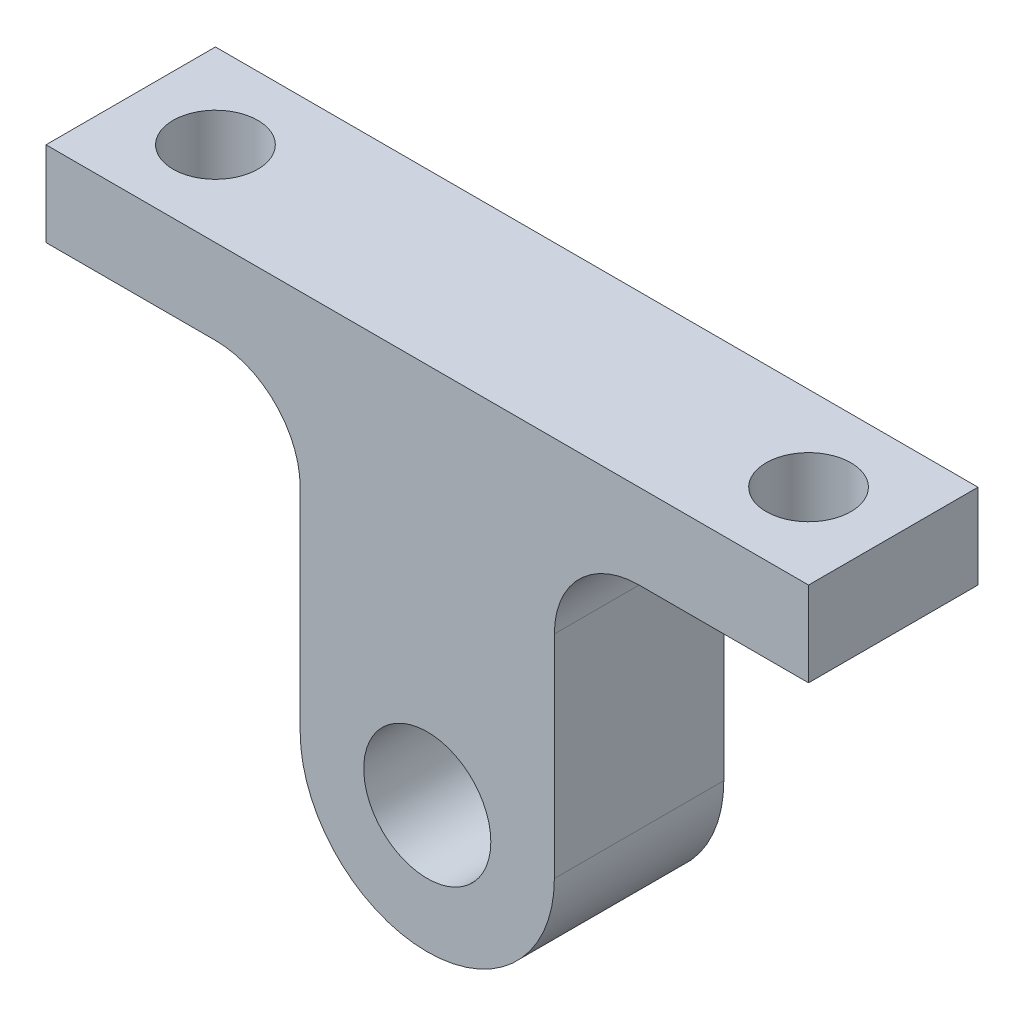
ISO-10303-21;
HEADER;
FILE_DESCRIPTION(('STEP AP214'),'2;1');
FILE_NAME('part.step','',(''),(''),'','','');
FILE_SCHEMA(('AUTOMOTIVE_DESIGN { 1 0 10303 214 1 1 1 1 }'));
ENDSEC;
DATA;
#1=APPLICATION_CONTEXT('core data for automotive mechanical design processes');
#2=APPLICATION_PROTOCOL_DEFINITION('international standard','automotive_design',2000,#1);
#3=PRODUCT_CONTEXT('',#1,'mechanical');
#4=PRODUCT('Part','Part','',(#3));
#5=PRODUCT_RELATED_PRODUCT_CATEGORY('part','',(#4));
#6=PRODUCT_DEFINITION_FORMATION('','',#4);
#7=PRODUCT_DEFINITION_CONTEXT('part definition',#1,'design');
#8=PRODUCT_DEFINITION('design','',#6,#7);
#9=PRODUCT_DEFINITION_SHAPE('','',#8);
#10=(LENGTH_UNIT() NAMED_UNIT(*) SI_UNIT(.MILLI.,.METRE.));
#11=(NAMED_UNIT(*) PLANE_ANGLE_UNIT() SI_UNIT($,.RADIAN.));
#12=(NAMED_UNIT(*) SI_UNIT($,.STERADIAN.) SOLID_ANGLE_UNIT());
#13=UNCERTAINTY_MEASURE_WITH_UNIT(LENGTH_MEASURE(1.E-05),#10,'distance_accuracy_value','');
#14=(GEOMETRIC_REPRESENTATION_CONTEXT(3) GLOBAL_UNCERTAINTY_ASSIGNED_CONTEXT((#13)) GLOBAL_UNIT_ASSIGNED_CONTEXT((#10,
#11,#12)) REPRESENTATION_CONTEXT('',''));
#15=CARTESIAN_POINT('',(0.,0.,0.));
#16=DIRECTION('',(0.,0.,1.));
#17=DIRECTION('',(1.,0.,0.));
#18=AXIS2_PLACEMENT_3D('',#15,#16,#17);
#19=CARTESIAN_POINT('',(0.,0.,6.35));
#20=DIRECTION('',(0.,0.,-1.));
#21=DIRECTION('',(-1.,0.,0.));
#22=AXIS2_PLACEMENT_3D('',#19,#20,#21);
#23=PLANE('',#22);
#24=CARTESIAN_POINT('',(0.,0.,6.35));
#25=DIRECTION('',(0.,0.,-1.));
#26=DIRECTION('',(-1.,0.,0.));
#27=AXIS2_PLACEMENT_3D('',#24,#25,#26);
#28=CIRCLE('',#27,9.525);
#29=CARTESIAN_POINT('',(-9.525,0.,6.35));
#30=VERTEX_POINT('',#29);
#31=CARTESIAN_POINT('',(0.,-9.52500000000001,6.35));
#32=VERTEX_POINT('',#31);
#33=EDGE_CURVE('E52',#30,#32,#28,.F.);
#34=ORIENTED_EDGE('',*,*,#33,.T.);
#35=CARTESIAN_POINT('',(0.,0.,6.35));
#36=DIRECTION('',(0.,0.,-1.));
#37=DIRECTION('',(-1.,0.,0.));
#38=AXIS2_PLACEMENT_3D('',#35,#36,#37);
#39=CIRCLE('',#38,9.525);
#40=CARTESIAN_POINT('',(9.525,0.,6.35));
#41=VERTEX_POINT('',#40);
#42=EDGE_CURVE('E45',#32,#41,#39,.F.);
#43=ORIENTED_EDGE('',*,*,#42,.T.);
#44=DIRECTION('',(0.,1.,0.));
#45=VECTOR('',#44,1.);
#46=CARTESIAN_POINT('',(9.525,-9.52500000000001,6.35));
#47=LINE('',#46,#45);
#48=CARTESIAN_POINT('',(9.525,15.875,6.35));
#49=VERTEX_POINT('',#48);
#50=EDGE_CURVE('E129',#41,#49,#47,.T.);
#51=ORIENTED_EDGE('',*,*,#50,.T.);
#52=CARTESIAN_POINT('',(15.875,15.875,6.35));
#53=DIRECTION('',(0.,0.,-1.));
#54=DIRECTION('',(-1.,0.,0.));
#55=AXIS2_PLACEMENT_3D('',#52,#53,#54);
#56=CIRCLE('',#55,6.35);
#57=CARTESIAN_POINT('',(15.875,22.225,6.35));
#58=VERTEX_POINT('',#57);
#59=EDGE_CURVE('E125',#49,#58,#56,.T.);
#60=ORIENTED_EDGE('',*,*,#59,.T.);
#61=DIRECTION('',(1.,0.,0.));
#62=VECTOR('',#61,1.);
#63=CARTESIAN_POINT('',(9.525,22.225,6.35));
#64=LINE('',#63,#62);
#65=CARTESIAN_POINT('',(28.575,22.225,6.35));
#66=VERTEX_POINT('',#65);
#67=EDGE_CURVE('E118',#58,#66,#64,.T.);
#68=ORIENTED_EDGE('',*,*,#67,.T.);
#69=DIRECTION('',(0.,1.,0.));
#70=VECTOR('',#69,1.);
#71=CARTESIAN_POINT('',(28.575,22.225,6.35));
#72=LINE('',#71,#70);
#73=CARTESIAN_POINT('',(28.575,28.575,6.35));
#74=VERTEX_POINT('',#73);
#75=EDGE_CURVE('E122',#66,#74,#72,.T.);
#76=ORIENTED_EDGE('',*,*,#75,.T.);
#77=DIRECTION('',(-1.,0.,0.));
#78=VECTOR('',#77,1.);
#79=CARTESIAN_POINT('',(28.575,28.575,6.35));
#80=LINE('',#79,#78);
#81=CARTESIAN_POINT('',(-28.575,28.575,6.35));
#82=VERTEX_POINT('',#81);
#83=EDGE_CURVE('E144',#74,#82,#80,.T.);
#84=ORIENTED_EDGE('',*,*,#83,.T.);
#85=DIRECTION('',(0.,-1.,0.));
#86=VECTOR('',#85,1.);
#87=CARTESIAN_POINT('',(-28.575,28.575,6.35));
#88=LINE('',#87,#86);
#89=CARTESIAN_POINT('',(-28.575,22.225,6.35));
#90=VERTEX_POINT('',#89);
#91=EDGE_CURVE('E146',#82,#90,#88,.T.);
#92=ORIENTED_EDGE('',*,*,#91,.T.);
#93=DIRECTION('',(1.,0.,0.));
#94=VECTOR('',#93,1.);
#95=CARTESIAN_POINT('',(-28.575,22.225,6.35));
#96=LINE('',#95,#94);
#97=CARTESIAN_POINT('',(-15.875,22.225,6.35));
#98=VERTEX_POINT('',#97);
#99=EDGE_CURVE('E167',#90,#98,#96,.T.);
#100=ORIENTED_EDGE('',*,*,#99,.T.);
#101=CARTESIAN_POINT('',(-15.875,15.875,6.35));
#102=DIRECTION('',(0.,0.,-1.));
#103=DIRECTION('',(-1.,0.,0.));
#104=AXIS2_PLACEMENT_3D('',#101,#102,#103);
#105=CIRCLE('',#104,6.35);
#106=CARTESIAN_POINT('',(-9.525,15.875,6.35));
#107=VERTEX_POINT('',#106);
#108=EDGE_CURVE('E185',#98,#107,#105,.T.);
#109=ORIENTED_EDGE('',*,*,#108,.T.);
#110=DIRECTION('',(0.,-1.,0.));
#111=VECTOR('',#110,1.);
#112=CARTESIAN_POINT('',(-9.52500000000001,22.225,6.35));
#113=LINE('',#112,#111);
#114=EDGE_CURVE('E208',#107,#30,#113,.T.);
#115=ORIENTED_EDGE('',*,*,#114,.T.);
#116=EDGE_LOOP('',(#34,#43,#51,#60,#68,#76,#84,#92,#100,#109,#115));
#117=FACE_BOUND('',#116,.T.);
#118=CARTESIAN_POINT('',(0.,0.,6.35));
#119=DIRECTION('',(0.,0.,1.));
#120=DIRECTION('',(1.,0.,0.));
#121=AXIS2_PLACEMENT_3D('',#118,#119,#120);
#122=CIRCLE('',#121,4.7625);
#123=CARTESIAN_POINT('',(4.7625,0.,6.35));
#124=VERTEX_POINT('',#123);
#125=EDGE_CURVE('E156',#124,#124,#122,.T.);
#126=ORIENTED_EDGE('',*,*,#125,.F.);
#127=EDGE_LOOP('',(#126));
#128=FACE_BOUND('',#127,.T.);
#129=ADVANCED_FACE('F36',(#117,#128),#23,.F.);
#130=CARTESIAN_POINT('',(0.,0.,-6.35));
#131=DIRECTION('',(0.,0.,-1.));
#132=DIRECTION('',(-1.,0.,0.));
#133=AXIS2_PLACEMENT_3D('',#130,#131,#132);
#134=PLANE('',#133);
#135=DIRECTION('',(0.,1.,0.));
#136=VECTOR('',#135,1.);
#137=CARTESIAN_POINT('',(9.525,-9.52500000000001,-6.35));
#138=LINE('',#137,#136);
#139=CARTESIAN_POINT('',(9.525,0.,-6.35));
#140=VERTEX_POINT('',#139);
#141=CARTESIAN_POINT('',(9.525,15.875,-6.35));
#142=VERTEX_POINT('',#141);
#143=EDGE_CURVE('E158',#140,#142,#138,.T.);
#144=ORIENTED_EDGE('',*,*,#143,.F.);
#145=CARTESIAN_POINT('',(0.,0.,-6.35));
#146=DIRECTION('',(0.,0.,-1.));
#147=DIRECTION('',(-1.,0.,0.));
#148=AXIS2_PLACEMENT_3D('',#145,#146,#147);
#149=CIRCLE('',#148,9.525);
#150=CARTESIAN_POINT('',(0.,-9.52500000000001,-6.35));
#151=VERTEX_POINT('',#150);
#152=EDGE_CURVE('E196',#140,#151,#149,.T.);
#153=ORIENTED_EDGE('',*,*,#152,.T.);
#154=CARTESIAN_POINT('',(0.,0.,-6.35));
#155=DIRECTION('',(0.,0.,-1.));
#156=DIRECTION('',(-1.,0.,0.));
#157=AXIS2_PLACEMENT_3D('',#154,#155,#156);
#158=CIRCLE('',#157,9.525);
#159=CARTESIAN_POINT('',(-9.525,0.,-6.35));
#160=VERTEX_POINT('',#159);
#161=EDGE_CURVE('E194',#151,#160,#158,.T.);
#162=ORIENTED_EDGE('',*,*,#161,.T.);
#163=DIRECTION('',(0.,-1.,0.));
#164=VECTOR('',#163,1.);
#165=CARTESIAN_POINT('',(-9.52500000000001,22.225,-6.35));
#166=LINE('',#165,#164);
#167=CARTESIAN_POINT('',(-9.525,15.875,-6.35));
#168=VERTEX_POINT('',#167);
#169=EDGE_CURVE('E155',#168,#160,#166,.T.);
#170=ORIENTED_EDGE('',*,*,#169,.F.);
#171=CARTESIAN_POINT('',(-15.875,15.875,-6.35));
#172=DIRECTION('',(0.,0.,-1.));
#173=DIRECTION('',(-1.,0.,0.));
#174=AXIS2_PLACEMENT_3D('',#171,#172,#173);
#175=CIRCLE('',#174,6.35);
#176=CARTESIAN_POINT('',(-15.875,22.225,-6.35));
#177=VERTEX_POINT('',#176);
#178=EDGE_CURVE('E183',#168,#177,#175,.F.);
#179=ORIENTED_EDGE('',*,*,#178,.T.);
#180=DIRECTION('',(1.,0.,0.));
#181=VECTOR('',#180,1.);
#182=CARTESIAN_POINT('',(-28.575,22.225,-6.35));
#183=LINE('',#182,#181);
#184=CARTESIAN_POINT('',(-28.575,22.225,-6.35));
#185=VERTEX_POINT('',#184);
#186=EDGE_CURVE('E152',#185,#177,#183,.T.);
#187=ORIENTED_EDGE('',*,*,#186,.F.);
#188=DIRECTION('',(0.,-1.,0.));
#189=VECTOR('',#188,1.);
#190=CARTESIAN_POINT('',(-28.575,28.575,-6.35));
#191=LINE('',#190,#189);
#192=CARTESIAN_POINT('',(-28.575,28.575,-6.35));
#193=VERTEX_POINT('',#192);
#194=EDGE_CURVE('E165',#193,#185,#191,.T.);
#195=ORIENTED_EDGE('',*,*,#194,.F.);
#196=DIRECTION('',(-1.,0.,0.));
#197=VECTOR('',#196,1.);
#198=CARTESIAN_POINT('',(28.575,28.575,-6.35));
#199=LINE('',#198,#197);
#200=CARTESIAN_POINT('',(28.575,28.575,-6.35));
#201=VERTEX_POINT('',#200);
#202=EDGE_CURVE('E163',#201,#193,#199,.T.);
#203=ORIENTED_EDGE('',*,*,#202,.F.);
#204=DIRECTION('',(0.,1.,0.));
#205=VECTOR('',#204,1.);
#206=CARTESIAN_POINT('',(28.575,22.225,-6.35));
#207=LINE('',#206,#205);
#208=CARTESIAN_POINT('',(28.575,22.225,-6.35));
#209=VERTEX_POINT('',#208);
#210=EDGE_CURVE('E161',#209,#201,#207,.T.);
#211=ORIENTED_EDGE('',*,*,#210,.F.);
#212=DIRECTION('',(1.,0.,0.));
#213=VECTOR('',#212,1.);
#214=CARTESIAN_POINT('',(9.525,22.225,-6.35));
#215=LINE('',#214,#213);
#216=CARTESIAN_POINT('',(15.875,22.225,-6.35));
#217=VERTEX_POINT('',#216);
#218=EDGE_CURVE('E135',#217,#209,#215,.T.);
#219=ORIENTED_EDGE('',*,*,#218,.F.);
#220=CARTESIAN_POINT('',(15.875,15.875,-6.35));
#221=DIRECTION('',(0.,0.,-1.));
#222=DIRECTION('',(-1.,0.,0.));
#223=AXIS2_PLACEMENT_3D('',#220,#221,#222);
#224=CIRCLE('',#223,6.35);
#225=EDGE_CURVE('E187',#217,#142,#224,.F.);
#226=ORIENTED_EDGE('',*,*,#225,.T.);
#227=EDGE_LOOP('',(#144,#153,#162,#170,#179,#187,#195,#203,#211,#219,#226));
#228=FACE_BOUND('',#227,.T.);
#229=CARTESIAN_POINT('',(0.,0.,-6.35));
#230=DIRECTION('',(0.,0.,1.));
#231=DIRECTION('',(1.,0.,0.));
#232=AXIS2_PLACEMENT_3D('',#229,#230,#231);
#233=CIRCLE('',#232,4.7625);
#234=CARTESIAN_POINT('',(4.7625,0.,-6.35));
#235=VERTEX_POINT('',#234);
#236=EDGE_CURVE('E216',#235,#235,#233,.T.);
#237=ORIENTED_EDGE('',*,*,#236,.T.);
#238=EDGE_LOOP('',(#237));
#239=FACE_BOUND('',#238,.T.);
#240=ADVANCED_FACE('F212',(#228,#239),#134,.T.);
#241=CARTESIAN_POINT('',(-28.575,22.225,6.35));
#242=DIRECTION('',(0.,1.,0.));
#243=DIRECTION('',(0.,0.,1.));
#244=AXIS2_PLACEMENT_3D('',#241,#242,#243);
#245=PLANE('',#244);
#246=CARTESIAN_POINT('',(-22.225,22.225,0.));
#247=DIRECTION('',(0.,1.,0.));
#248=DIRECTION('',(0.,0.,1.));
#249=AXIS2_PLACEMENT_3D('',#246,#247,#248);
#250=CIRCLE('',#249,3.175);
#251=CARTESIAN_POINT('',(-25.4,22.225,0.));
#252=VERTEX_POINT('',#251);
#253=EDGE_CURVE('E217',#252,#252,#250,.T.);
#254=ORIENTED_EDGE('',*,*,#253,.T.);
#255=EDGE_LOOP('',(#254));
#256=FACE_BOUND('',#255,.T.);
#257=ORIENTED_EDGE('',*,*,#186,.T.);
#258=DIRECTION('',(0.,0.,-1.));
#259=VECTOR('',#258,1.);
#260=CARTESIAN_POINT('',(-15.875,22.225,6.35));
#261=LINE('',#260,#259);
#262=EDGE_CURVE('E176',#177,#98,#261,.F.);
#263=ORIENTED_EDGE('',*,*,#262,.T.);
#264=ORIENTED_EDGE('',*,*,#99,.F.);
#265=DIRECTION('',(0.,0.,-1.));
#266=VECTOR('',#265,1.);
#267=CARTESIAN_POINT('',(-28.575,22.225,6.35));
#268=LINE('',#267,#266);
#269=EDGE_CURVE('E151',#90,#185,#268,.T.);
#270=ORIENTED_EDGE('',*,*,#269,.T.);
#271=EDGE_LOOP('',(#257,#263,#264,#270));
#272=FACE_BOUND('',#271,.T.);
#273=ADVANCED_FACE('F243',(#256,#272),#245,.F.);
#274=CARTESIAN_POINT('',(-9.52500000000001,22.225,6.35));
#275=DIRECTION('',(1.,0.,0.));
#276=DIRECTION('',(0.,1.,0.));
#277=AXIS2_PLACEMENT_3D('',#274,#275,#276);
#278=PLANE('',#277);
#279=ORIENTED_EDGE('',*,*,#169,.T.);
#280=DIRECTION('',(0.,0.,-1.));
#281=VECTOR('',#280,1.);
#282=CARTESIAN_POINT('',(-9.525,0.,6.35));
#283=LINE('',#282,#281);
#284=EDGE_CURVE('E11',#160,#30,#283,.F.);
#285=ORIENTED_EDGE('',*,*,#284,.T.);
#286=ORIENTED_EDGE('',*,*,#114,.F.);
#287=DIRECTION('',(0.,0.,-1.));
#288=VECTOR('',#287,1.);
#289=CARTESIAN_POINT('',(-9.525,15.875,-6.35));
#290=LINE('',#289,#288);
#291=EDGE_CURVE('E138',#107,#168,#290,.T.);
#292=ORIENTED_EDGE('',*,*,#291,.T.);
#293=EDGE_LOOP('',(#279,#285,#286,#292));
#294=FACE_BOUND('',#293,.T.);
#295=ADVANCED_FACE('F236',(#294),#278,.F.);
#296=CARTESIAN_POINT('',(9.525,-9.52500000000001,6.35));
#297=DIRECTION('',(-1.,0.,0.));
#298=DIRECTION('',(0.,0.,1.));
#299=AXIS2_PLACEMENT_3D('',#296,#297,#298);
#300=PLANE('',#299);
#301=ORIENTED_EDGE('',*,*,#50,.F.);
#302=DIRECTION('',(0.,0.,-1.));
#303=VECTOR('',#302,1.);
#304=CARTESIAN_POINT('',(9.525,0.,6.35));
#305=LINE('',#304,#303);
#306=EDGE_CURVE('E191',#41,#140,#305,.T.);
#307=ORIENTED_EDGE('',*,*,#306,.T.);
#308=ORIENTED_EDGE('',*,*,#143,.T.);
#309=DIRECTION('',(0.,0.,-1.));
#310=VECTOR('',#309,1.);
#311=CARTESIAN_POINT('',(9.525,15.875,6.35));
#312=LINE('',#311,#310);
#313=EDGE_CURVE('E180',#142,#49,#312,.F.);
#314=ORIENTED_EDGE('',*,*,#313,.T.);
#315=EDGE_LOOP('',(#301,#307,#308,#314));
#316=FACE_BOUND('',#315,.T.);
#317=ADVANCED_FACE('F205',(#316),#300,.F.);
#318=CARTESIAN_POINT('',(9.525,22.225,6.35));
#319=DIRECTION('',(0.,1.,0.));
#320=DIRECTION('',(-1.,0.,0.));
#321=AXIS2_PLACEMENT_3D('',#318,#319,#320);
#322=PLANE('',#321);
#323=CARTESIAN_POINT('',(22.225,22.225,0.));
#324=DIRECTION('',(0.,1.,0.));
#325=DIRECTION('',(-1.,0.,0.));
#326=AXIS2_PLACEMENT_3D('',#323,#324,#325);
#327=CIRCLE('',#326,3.175);
#328=CARTESIAN_POINT('',(19.05,22.225,0.));
#329=VERTEX_POINT('',#328);
#330=EDGE_CURVE('E226',#329,#329,#327,.T.);
#331=ORIENTED_EDGE('',*,*,#330,.T.);
#332=EDGE_LOOP('',(#331));
#333=FACE_BOUND('',#332,.T.);
#334=ORIENTED_EDGE('',*,*,#67,.F.);
#335=DIRECTION('',(0.,0.,-1.));
#336=VECTOR('',#335,1.);
#337=CARTESIAN_POINT('',(15.875,22.225,-6.35));
#338=LINE('',#337,#336);
#339=EDGE_CURVE('E178',#58,#217,#338,.T.);
#340=ORIENTED_EDGE('',*,*,#339,.T.);
#341=ORIENTED_EDGE('',*,*,#218,.T.);
#342=DIRECTION('',(0.,0.,-1.));
#343=VECTOR('',#342,1.);
#344=CARTESIAN_POINT('',(28.575,22.225,6.35));
#345=LINE('',#344,#343);
#346=EDGE_CURVE('E132',#66,#209,#345,.T.);
#347=ORIENTED_EDGE('',*,*,#346,.F.);
#348=EDGE_LOOP('',(#334,#340,#341,#347));
#349=FACE_BOUND('',#348,.T.);
#350=ADVANCED_FACE('F133',(#333,#349),#322,.F.);
#351=CARTESIAN_POINT('',(28.575,22.225,6.35));
#352=DIRECTION('',(-1.,0.,0.));
#353=DIRECTION('',(0.,0.,1.));
#354=AXIS2_PLACEMENT_3D('',#351,#352,#353);
#355=PLANE('',#354);
#356=ORIENTED_EDGE('',*,*,#210,.T.);
#357=DIRECTION('',(0.,0.,-1.));
#358=VECTOR('',#357,1.);
#359=CARTESIAN_POINT('',(28.575,28.575,6.35));
#360=LINE('',#359,#358);
#361=EDGE_CURVE('E139',#74,#201,#360,.T.);
#362=ORIENTED_EDGE('',*,*,#361,.F.);
#363=ORIENTED_EDGE('',*,*,#75,.F.);
#364=ORIENTED_EDGE('',*,*,#346,.T.);
#365=EDGE_LOOP('',(#356,#362,#363,#364));
#366=FACE_BOUND('',#365,.T.);
#367=ADVANCED_FACE('F141',(#366),#355,.F.);
#368=CARTESIAN_POINT('',(28.575,28.575,6.35));
#369=DIRECTION('',(0.,-1.,0.));
#370=DIRECTION('',(1.,0.,0.));
#371=AXIS2_PLACEMENT_3D('',#368,#369,#370);
#372=PLANE('',#371);
#373=CARTESIAN_POINT('',(22.225,28.575,0.));
#374=DIRECTION('',(0.,1.,0.));
#375=DIRECTION('',(-1.,0.,0.));
#376=AXIS2_PLACEMENT_3D('',#373,#374,#375);
#377=CIRCLE('',#376,3.175);
#378=CARTESIAN_POINT('',(19.05,28.575,0.));
#379=VERTEX_POINT('',#378);
#380=EDGE_CURVE('E286',#379,#379,#377,.T.);
#381=ORIENTED_EDGE('',*,*,#380,.F.);
#382=EDGE_LOOP('',(#381));
#383=FACE_BOUND('',#382,.T.);
#384=CARTESIAN_POINT('',(-22.225,28.575,0.));
#385=DIRECTION('',(0.,1.,0.));
#386=DIRECTION('',(-1.,0.,0.));
#387=AXIS2_PLACEMENT_3D('',#384,#385,#386);
#388=CIRCLE('',#387,3.175);
#389=CARTESIAN_POINT('',(-25.4,28.575,0.));
#390=VERTEX_POINT('',#389);
#391=EDGE_CURVE('E221',#390,#390,#388,.T.);
#392=ORIENTED_EDGE('',*,*,#391,.F.);
#393=EDGE_LOOP('',(#392));
#394=FACE_BOUND('',#393,.T.);
#395=ORIENTED_EDGE('',*,*,#202,.T.);
#396=DIRECTION('',(0.,0.,-1.));
#397=VECTOR('',#396,1.);
#398=CARTESIAN_POINT('',(-28.575,28.575,6.35));
#399=LINE('',#398,#397);
#400=EDGE_CURVE('E170',#82,#193,#399,.T.);
#401=ORIENTED_EDGE('',*,*,#400,.F.);
#402=ORIENTED_EDGE('',*,*,#83,.F.);
#403=ORIENTED_EDGE('',*,*,#361,.T.);
#404=EDGE_LOOP('',(#395,#401,#402,#403));
#405=FACE_BOUND('',#404,.T.);
#406=ADVANCED_FACE('F252',(#383,#394,#405),#372,.F.);
#407=CARTESIAN_POINT('',(-28.575,28.575,6.35));
#408=DIRECTION('',(1.,0.,0.));
#409=DIRECTION('',(0.,0.,-1.));
#410=AXIS2_PLACEMENT_3D('',#407,#408,#409);
#411=PLANE('',#410);
#412=ORIENTED_EDGE('',*,*,#194,.T.);
#413=ORIENTED_EDGE('',*,*,#269,.F.);
#414=ORIENTED_EDGE('',*,*,#91,.F.);
#415=ORIENTED_EDGE('',*,*,#400,.T.);
#416=EDGE_LOOP('',(#412,#413,#414,#415));
#417=FACE_BOUND('',#416,.T.);
#418=ADVANCED_FACE('F248',(#417),#411,.F.);
#419=CARTESIAN_POINT('',(0.,0.,6.35));
#420=DIRECTION('',(0.,0.,-1.));
#421=DIRECTION('',(-1.,0.,0.));
#422=AXIS2_PLACEMENT_3D('',#419,#420,#421);
#423=CYLINDRICAL_SURFACE('',#422,4.7625);
#424=ORIENTED_EDGE('',*,*,#125,.T.);
#425=EDGE_LOOP('',(#424));
#426=FACE_BOUND('',#425,.T.);
#427=ORIENTED_EDGE('',*,*,#236,.F.);
#428=EDGE_LOOP('',(#427));
#429=FACE_BOUND('',#428,.T.);
#430=ADVANCED_FACE('F260',(#426,#429),#423,.F.);
#431=CARTESIAN_POINT('',(-15.875,15.875,6.35));
#432=DIRECTION('',(0.,0.,1.));
#433=DIRECTION('',(1.,0.,0.));
#434=AXIS2_PLACEMENT_3D('',#431,#432,#433);
#435=CYLINDRICAL_SURFACE('',#434,6.35);
#436=ORIENTED_EDGE('',*,*,#108,.F.);
#437=ORIENTED_EDGE('',*,*,#262,.F.);
#438=ORIENTED_EDGE('',*,*,#178,.F.);
#439=ORIENTED_EDGE('',*,*,#291,.F.);
#440=EDGE_LOOP('',(#436,#437,#438,#439));
#441=FACE_BOUND('',#440,.T.);
#442=ADVANCED_FACE('F238',(#441),#435,.F.);
#443=CARTESIAN_POINT('',(15.875,15.875,6.35));
#444=DIRECTION('',(0.,0.,1.));
#445=DIRECTION('',(1.,0.,0.));
#446=AXIS2_PLACEMENT_3D('',#443,#444,#445);
#447=CYLINDRICAL_SURFACE('',#446,6.35);
#448=ORIENTED_EDGE('',*,*,#59,.F.);
#449=ORIENTED_EDGE('',*,*,#313,.F.);
#450=ORIENTED_EDGE('',*,*,#225,.F.);
#451=ORIENTED_EDGE('',*,*,#339,.F.);
#452=EDGE_LOOP('',(#448,#449,#450,#451));
#453=FACE_BOUND('',#452,.T.);
#454=ADVANCED_FACE('F304',(#453),#447,.F.);
#455=CARTESIAN_POINT('',(0.,0.,6.35));
#456=DIRECTION('',(0.,0.,-1.));
#457=DIRECTION('',(-1.,0.,0.));
#458=AXIS2_PLACEMENT_3D('',#455,#456,#457);
#459=CYLINDRICAL_SURFACE('',#458,9.525);
#460=DIRECTION('',(0.,0.,-1.));
#461=VECTOR('',#460,1.);
#462=CARTESIAN_POINT('',(0.,-9.52500000000001,6.35));
#463=LINE('',#462,#461);
#464=EDGE_CURVE('E40',#32,#151,#463,.T.);
#465=ORIENTED_EDGE('',*,*,#464,.F.);
#466=ORIENTED_EDGE('',*,*,#33,.F.);
#467=ORIENTED_EDGE('',*,*,#284,.F.);
#468=ORIENTED_EDGE('',*,*,#161,.F.);
#469=EDGE_LOOP('',(#465,#466,#467,#468));
#470=FACE_BOUND('',#469,.T.);
#471=ADVANCED_FACE('F38',(#470),#459,.T.);
#472=CARTESIAN_POINT('',(0.,0.,6.35));
#473=DIRECTION('',(0.,0.,-1.));
#474=DIRECTION('',(-1.,0.,0.));
#475=AXIS2_PLACEMENT_3D('',#472,#473,#474);
#476=CYLINDRICAL_SURFACE('',#475,9.525);
#477=ORIENTED_EDGE('',*,*,#42,.F.);
#478=ORIENTED_EDGE('',*,*,#464,.T.);
#479=ORIENTED_EDGE('',*,*,#152,.F.);
#480=ORIENTED_EDGE('',*,*,#306,.F.);
#481=EDGE_LOOP('',(#477,#478,#479,#480));
#482=FACE_BOUND('',#481,.T.);
#483=ADVANCED_FACE('F209',(#482),#476,.T.);
#484=CARTESIAN_POINT('',(-22.225,-9.52500000000001,0.));
#485=DIRECTION('',(0.,1.,0.));
#486=DIRECTION('',(-1.,0.,0.));
#487=AXIS2_PLACEMENT_3D('',#484,#485,#486);
#488=CYLINDRICAL_SURFACE('',#487,3.175);
#489=CARTESIAN_POINT('',(-25.4,28.575,0.));
#490=CARTESIAN_POINT('',(-25.4,28.5088541666667,0.));
#491=CARTESIAN_POINT('',(-25.4,28.4427083333333,0.));
#492=CARTESIAN_POINT('',(-25.4,28.3104166666667,0.));
#493=CARTESIAN_POINT('',(-25.4,28.2442708333333,0.));
#494=CARTESIAN_POINT('',(-25.4,28.1119791666667,0.));
#495=CARTESIAN_POINT('',(-25.4,28.0458333333333,0.));
#496=CARTESIAN_POINT('',(-25.4,27.9135416666667,0.));
#497=CARTESIAN_POINT('',(-25.4,27.8473958333333,0.));
#498=CARTESIAN_POINT('',(-25.4,27.7151041666667,0.));
#499=CARTESIAN_POINT('',(-25.4,27.6489583333333,0.));
#500=CARTESIAN_POINT('',(-25.4,27.5166666666667,0.));
#501=CARTESIAN_POINT('',(-25.4,27.4505208333333,0.));
#502=CARTESIAN_POINT('',(-25.4,27.3182291666667,0.));
#503=CARTESIAN_POINT('',(-25.4,27.2520833333333,0.));
#504=CARTESIAN_POINT('',(-25.4,27.1197916666667,0.));
#505=CARTESIAN_POINT('',(-25.4,27.0536458333333,0.));
#506=CARTESIAN_POINT('',(-25.4,26.9213541666667,0.));
#507=CARTESIAN_POINT('',(-25.4,26.8552083333333,0.));
#508=CARTESIAN_POINT('',(-25.4,26.7229166666667,0.));
#509=CARTESIAN_POINT('',(-25.4,26.6567708333333,0.));
#510=CARTESIAN_POINT('',(-25.4,26.5244791666667,0.));
#511=CARTESIAN_POINT('',(-25.4,26.4583333333333,0.));
#512=CARTESIAN_POINT('',(-25.4,26.3260416666667,0.));
#513=CARTESIAN_POINT('',(-25.4,26.2598958333333,0.));
#514=CARTESIAN_POINT('',(-25.4,26.1276041666667,0.));
#515=CARTESIAN_POINT('',(-25.4,26.0614583333333,0.));
#516=CARTESIAN_POINT('',(-25.4,25.9291666666667,0.));
#517=CARTESIAN_POINT('',(-25.4,25.8630208333333,0.));
#518=CARTESIAN_POINT('',(-25.4,25.7307291666667,0.));
#519=CARTESIAN_POINT('',(-25.4,25.6645833333333,0.));
#520=CARTESIAN_POINT('',(-25.4,25.5322916666667,0.));
#521=CARTESIAN_POINT('',(-25.4,25.4661458333333,0.));
#522=CARTESIAN_POINT('',(-25.4,25.3338541666667,0.));
#523=CARTESIAN_POINT('',(-25.4,25.2677083333333,0.));
#524=CARTESIAN_POINT('',(-25.4,25.1354166666667,0.));
#525=CARTESIAN_POINT('',(-25.4,25.0692708333333,0.));
#526=CARTESIAN_POINT('',(-25.4,24.9369791666667,0.));
#527=CARTESIAN_POINT('',(-25.4,24.8708333333333,0.));
#528=CARTESIAN_POINT('',(-25.4,24.7385416666667,0.));
#529=CARTESIAN_POINT('',(-25.4,24.6723958333333,0.));
#530=CARTESIAN_POINT('',(-25.4,24.5401041666667,0.));
#531=CARTESIAN_POINT('',(-25.4,24.4739583333333,0.));
#532=CARTESIAN_POINT('',(-25.4,24.3416666666667,0.));
#533=CARTESIAN_POINT('',(-25.4,24.2755208333333,0.));
#534=CARTESIAN_POINT('',(-25.4,24.1432291666667,0.));
#535=CARTESIAN_POINT('',(-25.4,24.0770833333333,0.));
#536=CARTESIAN_POINT('',(-25.4,23.9447916666667,0.));
#537=CARTESIAN_POINT('',(-25.4,23.8786458333333,0.));
#538=CARTESIAN_POINT('',(-25.4,23.7463541666667,0.));
#539=CARTESIAN_POINT('',(-25.4,23.6802083333333,0.));
#540=CARTESIAN_POINT('',(-25.4,23.5479166666667,0.));
#541=CARTESIAN_POINT('',(-25.4,23.4817708333333,0.));
#542=CARTESIAN_POINT('',(-25.4,23.3494791666667,0.));
#543=CARTESIAN_POINT('',(-25.4,23.2833333333333,0.));
#544=CARTESIAN_POINT('',(-25.4,23.1510416666667,0.));
#545=CARTESIAN_POINT('',(-25.4,23.0848958333333,0.));
#546=CARTESIAN_POINT('',(-25.4,22.9526041666667,0.));
#547=CARTESIAN_POINT('',(-25.4,22.8864583333333,0.));
#548=CARTESIAN_POINT('',(-25.4,22.7541666666667,0.));
#549=CARTESIAN_POINT('',(-25.4,22.6880208333333,0.));
#550=CARTESIAN_POINT('',(-25.4,22.5557291666666,0.));
#551=CARTESIAN_POINT('',(-25.4,22.4895833333333,0.));
#552=CARTESIAN_POINT('',(-25.4,22.3572916666667,0.));
#553=CARTESIAN_POINT('',(-25.4,22.2911458333333,0.));
#554=CARTESIAN_POINT('',(-25.4,22.225,0.));
#555=B_SPLINE_CURVE_WITH_KNOTS('',3,(#489,#490,#491,#492,#493,#494,#495,#496,#497,#498,#499,
#500,#501,#502,#503,#504,#505,#506,#507,#508,#509,#510,#511,#512,#513,#514,#515,#516,#517,#518,
#519,#520,#521,#522,#523,#524,#525,#526,#527,#528,#529,#530,#531,#532,#533,#534,#535,#536,#537,
#538,#539,#540,#541,#542,#543,#544,#545,#546,#547,#548,#549,#550,#551,#552,#553,#554),
.UNSPECIFIED.,.F.,.F.,(4,2,2,2,2,2,2,2,2,2,2,2,2,2,2,2,2,2,2,2,2,2,2,2,2,2,2,2,2,2,2,2,4),(0.,
0.198437500000002,0.396874999999998,0.5953125,0.793750000000003,0.992187499999998,1.190625,
1.3890625,1.58750000000001,1.7859375,1.984375,2.18281250000001,2.38125,2.5796875,
2.77812500000001,2.9765625,3.175,3.37343750000001,3.571875,3.7703125,3.96875000000001,4.1671875,
4.365625,4.56406250000001,4.7625,4.96093750000001,5.15937500000001,5.3578125,5.55625000000001,
5.75468750000001,5.95312500000001,6.15156250000001,6.35000000000001),.UNSPECIFIED.);
#556=EDGE_CURVE('BSEAM275',#390,#252,#555,.T.);
#557=ORIENTED_EDGE('',*,*,#391,.T.);
#558=ORIENTED_EDGE('',*,*,#253,.F.);
#559=ORIENTED_EDGE('',*,*,#556,.T.);
#560=ORIENTED_EDGE('',*,*,#556,.F.);
#561=EDGE_LOOP('',(#557,#559,#558,#560));
#562=FACE_BOUND('',#561,.T.);
#563=ADVANCED_FACE('F275',(#562),#488,.F.);
#564=CARTESIAN_POINT('',(22.225,-9.525,0.));
#565=DIRECTION('',(0.,1.,0.));
#566=DIRECTION('',(-1.,0.,0.));
#567=AXIS2_PLACEMENT_3D('',#564,#565,#566);
#568=CYLINDRICAL_SURFACE('',#567,3.175);
#569=CARTESIAN_POINT('',(19.05,28.575,0.));
#570=CARTESIAN_POINT('',(19.05,28.5088541666667,0.));
#571=CARTESIAN_POINT('',(19.05,28.4427083333333,0.));
#572=CARTESIAN_POINT('',(19.05,28.3104166666667,0.));
#573=CARTESIAN_POINT('',(19.05,28.2442708333333,0.));
#574=CARTESIAN_POINT('',(19.05,28.1119791666667,0.));
#575=CARTESIAN_POINT('',(19.05,28.0458333333333,0.));
#576=CARTESIAN_POINT('',(19.05,27.9135416666667,0.));
#577=CARTESIAN_POINT('',(19.05,27.8473958333333,0.));
#578=CARTESIAN_POINT('',(19.05,27.7151041666667,0.));
#579=CARTESIAN_POINT('',(19.05,27.6489583333333,0.));
#580=CARTESIAN_POINT('',(19.05,27.5166666666667,0.));
#581=CARTESIAN_POINT('',(19.05,27.4505208333333,0.));
#582=CARTESIAN_POINT('',(19.05,27.3182291666667,0.));
#583=CARTESIAN_POINT('',(19.05,27.2520833333333,0.));
#584=CARTESIAN_POINT('',(19.05,27.1197916666667,0.));
#585=CARTESIAN_POINT('',(19.05,27.0536458333333,0.));
#586=CARTESIAN_POINT('',(19.05,26.9213541666667,0.));
#587=CARTESIAN_POINT('',(19.05,26.8552083333333,0.));
#588=CARTESIAN_POINT('',(19.05,26.7229166666667,0.));
#589=CARTESIAN_POINT('',(19.05,26.6567708333333,0.));
#590=CARTESIAN_POINT('',(19.05,26.5244791666667,0.));
#591=CARTESIAN_POINT('',(19.05,26.4583333333333,0.));
#592=CARTESIAN_POINT('',(19.05,26.3260416666667,0.));
#593=CARTESIAN_POINT('',(19.05,26.2598958333333,0.));
#594=CARTESIAN_POINT('',(19.05,26.1276041666667,0.));
#595=CARTESIAN_POINT('',(19.05,26.0614583333333,0.));
#596=CARTESIAN_POINT('',(19.05,25.9291666666667,0.));
#597=CARTESIAN_POINT('',(19.05,25.8630208333333,0.));
#598=CARTESIAN_POINT('',(19.05,25.7307291666667,0.));
#599=CARTESIAN_POINT('',(19.05,25.6645833333333,0.));
#600=CARTESIAN_POINT('',(19.05,25.5322916666667,0.));
#601=CARTESIAN_POINT('',(19.05,25.4661458333333,0.));
#602=CARTESIAN_POINT('',(19.05,25.3338541666667,0.));
#603=CARTESIAN_POINT('',(19.05,25.2677083333333,0.));
#604=CARTESIAN_POINT('',(19.05,25.1354166666667,0.));
#605=CARTESIAN_POINT('',(19.05,25.0692708333333,0.));
#606=CARTESIAN_POINT('',(19.05,24.9369791666667,0.));
#607=CARTESIAN_POINT('',(19.05,24.8708333333333,0.));
#608=CARTESIAN_POINT('',(19.05,24.7385416666667,0.));
#609=CARTESIAN_POINT('',(19.05,24.6723958333333,0.));
#610=CARTESIAN_POINT('',(19.05,24.5401041666667,0.));
#611=CARTESIAN_POINT('',(19.05,24.4739583333333,0.));
#612=CARTESIAN_POINT('',(19.05,24.3416666666667,0.));
#613=CARTESIAN_POINT('',(19.05,24.2755208333333,0.));
#614=CARTESIAN_POINT('',(19.05,24.1432291666667,0.));
#615=CARTESIAN_POINT('',(19.05,24.0770833333333,0.));
#616=CARTESIAN_POINT('',(19.05,23.9447916666667,0.));
#617=CARTESIAN_POINT('',(19.05,23.8786458333333,0.));
#618=CARTESIAN_POINT('',(19.05,23.7463541666667,0.));
#619=CARTESIAN_POINT('',(19.05,23.6802083333333,0.));
#620=CARTESIAN_POINT('',(19.05,23.5479166666667,0.));
#621=CARTESIAN_POINT('',(19.05,23.4817708333333,0.));
#622=CARTESIAN_POINT('',(19.05,23.3494791666667,0.));
#623=CARTESIAN_POINT('',(19.05,23.2833333333333,0.));
#624=CARTESIAN_POINT('',(19.05,23.1510416666667,0.));
#625=CARTESIAN_POINT('',(19.05,23.0848958333333,0.));
#626=CARTESIAN_POINT('',(19.05,22.9526041666667,0.));
#627=CARTESIAN_POINT('',(19.05,22.8864583333333,0.));
#628=CARTESIAN_POINT('',(19.05,22.7541666666667,0.));
#629=CARTESIAN_POINT('',(19.05,22.6880208333333,0.));
#630=CARTESIAN_POINT('',(19.05,22.5557291666667,0.));
#631=CARTESIAN_POINT('',(19.05,22.4895833333333,0.));
#632=CARTESIAN_POINT('',(19.05,22.3572916666667,0.));
#633=CARTESIAN_POINT('',(19.05,22.2911458333333,0.));
#634=CARTESIAN_POINT('',(19.05,22.225,0.));
#635=B_SPLINE_CURVE_WITH_KNOTS('',3,(#569,#570,#571,#572,#573,#574,#575,#576,#577,#578,#579,
#580,#581,#582,#583,#584,#585,#586,#587,#588,#589,#590,#591,#592,#593,#594,#595,#596,#597,#598,
#599,#600,#601,#602,#603,#604,#605,#606,#607,#608,#609,#610,#611,#612,#613,#614,#615,#616,#617,
#618,#619,#620,#621,#622,#623,#624,#625,#626,#627,#628,#629,#630,#631,#632,#633,#634),
.UNSPECIFIED.,.F.,.F.,(4,2,2,2,2,2,2,2,2,2,2,2,2,2,2,2,2,2,2,2,2,2,2,2,2,2,2,2,2,2,2,2,4),(0.,
0.198437500000002,0.396874999999998,0.5953125,0.793750000000003,0.992187499999998,1.190625,
1.3890625,1.58750000000001,1.7859375,1.984375,2.18281250000001,2.38125,2.5796875,
2.77812500000001,2.9765625,3.175,3.37343750000001,3.571875,3.7703125,3.96875000000001,4.1671875,
4.365625,4.56406250000001,4.7625,4.96093750000001,5.15937500000001,5.3578125,5.55625000000001,
5.75468750000001,5.95312500000001,6.15156250000001,6.35000000000001),.UNSPECIFIED.);
#636=EDGE_CURVE('BSEAM278',#379,#329,#635,.T.);
#637=ORIENTED_EDGE('',*,*,#380,.T.);
#638=ORIENTED_EDGE('',*,*,#330,.F.);
#639=ORIENTED_EDGE('',*,*,#636,.T.);
#640=ORIENTED_EDGE('',*,*,#636,.F.);
#641=EDGE_LOOP('',(#637,#639,#638,#640));
#642=FACE_BOUND('',#641,.T.);
#643=ADVANCED_FACE('F278',(#642),#568,.F.);
#644=CLOSED_SHELL('',(#129,#240,#273,#295,#317,#350,#367,#406,#418,#430,#442,#454,#471,#483,
#563,#643));
#645=MANIFOLD_SOLID_BREP('B2',#644);
#646=ADVANCED_BREP_SHAPE_REPRESENTATION('',(#18,#645),#14);
#647=SHAPE_DEFINITION_REPRESENTATION(#9,#646);
ENDSEC;
END-ISO-10303-21;
